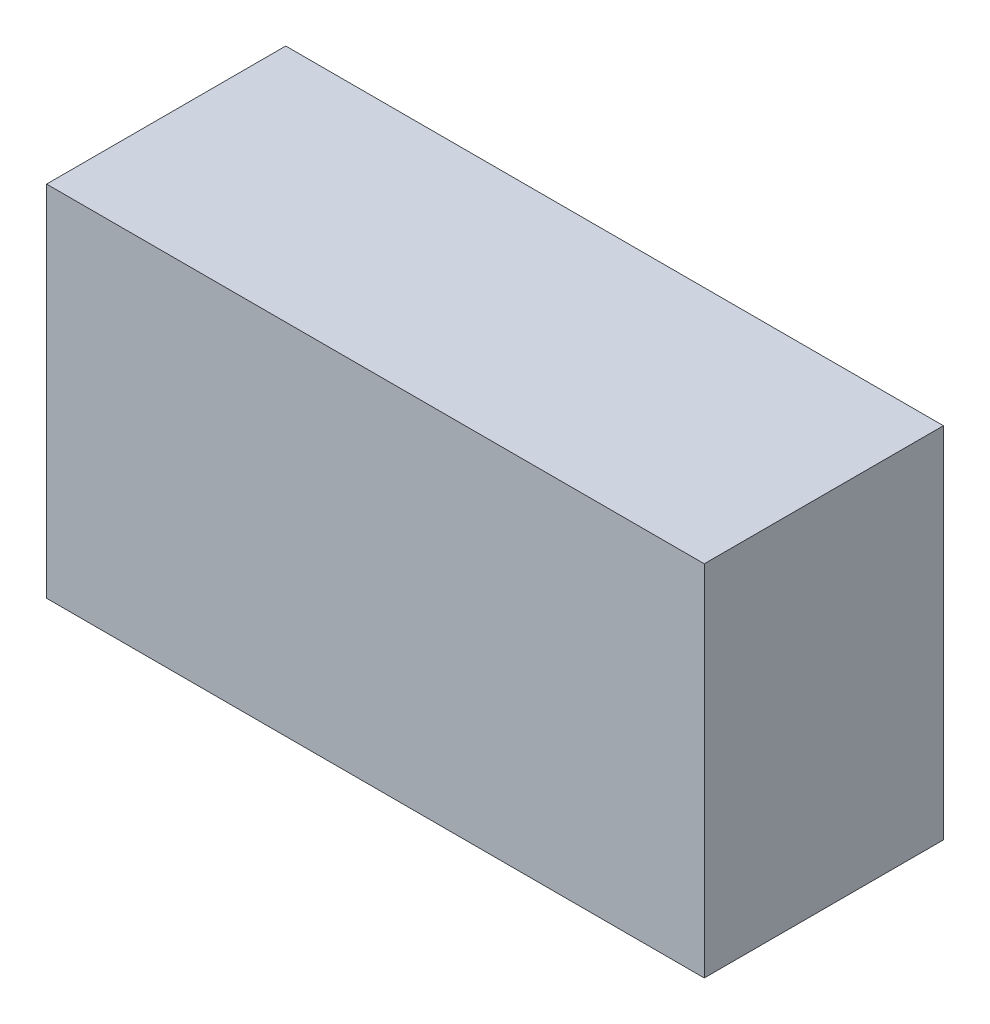
ISO-10303-21;
HEADER;
FILE_DESCRIPTION(('STEP AP214'),'2;1');
FILE_NAME('part.step','',(''),(''),'','','');
FILE_SCHEMA(('AUTOMOTIVE_DESIGN { 1 0 10303 214 1 1 1 1 }'));
ENDSEC;
DATA;
#1=APPLICATION_CONTEXT('core data for automotive mechanical design processes');
#2=APPLICATION_PROTOCOL_DEFINITION('international standard','automotive_design',2000,#1);
#3=PRODUCT_CONTEXT('',#1,'mechanical');
#4=PRODUCT('Part','Part','',(#3));
#5=PRODUCT_RELATED_PRODUCT_CATEGORY('part','',(#4));
#6=PRODUCT_DEFINITION_FORMATION('','',#4);
#7=PRODUCT_DEFINITION_CONTEXT('part definition',#1,'design');
#8=PRODUCT_DEFINITION('design','',#6,#7);
#9=PRODUCT_DEFINITION_SHAPE('','',#8);
#10=(LENGTH_UNIT() NAMED_UNIT(*) SI_UNIT(.MILLI.,.METRE.));
#11=(NAMED_UNIT(*) PLANE_ANGLE_UNIT() SI_UNIT($,.RADIAN.));
#12=(NAMED_UNIT(*) SI_UNIT($,.STERADIAN.) SOLID_ANGLE_UNIT());
#13=UNCERTAINTY_MEASURE_WITH_UNIT(LENGTH_MEASURE(1.E-05),#10,'distance_accuracy_value','');
#14=(GEOMETRIC_REPRESENTATION_CONTEXT(3) GLOBAL_UNCERTAINTY_ASSIGNED_CONTEXT((#13)) GLOBAL_UNIT_ASSIGNED_CONTEXT((#10,
#11,#12)) REPRESENTATION_CONTEXT('',''));
#15=CARTESIAN_POINT('',(0.,0.,0.));
#16=DIRECTION('',(0.,0.,1.));
#17=DIRECTION('',(1.,0.,0.));
#18=AXIS2_PLACEMENT_3D('',#15,#16,#17);
#19=CARTESIAN_POINT('',(-0.5499989,-0.2999994,0.));
#20=DIRECTION('',(0.,1.,0.));
#21=DIRECTION('',(1.,0.,0.));
#22=AXIS2_PLACEMENT_3D('',#19,#20,#21);
#23=PLANE('',#22);
#24=DIRECTION('',(1.,0.,0.));
#25=VECTOR('',#24,1.);
#26=CARTESIAN_POINT('',(-0.5499989,-0.2999994,0.));
#27=LINE('',#26,#25);
#28=CARTESIAN_POINT('',(-0.5499989,-0.2999994,0.));
#29=VERTEX_POINT('',#28);
#30=CARTESIAN_POINT('',(0.5499989,-0.2999994,0.));
#31=VERTEX_POINT('',#30);
#32=EDGE_CURVE('E9',#29,#31,#27,.T.);
#33=ORIENTED_EDGE('',*,*,#32,.T.);
#34=DIRECTION('',(0.,0.,1.));
#35=VECTOR('',#34,1.);
#36=CARTESIAN_POINT('',(0.5499989,-0.2999994,0.));
#37=LINE('',#36,#35);
#38=CARTESIAN_POINT('',(0.5499989,-0.2999994,0.3999992));
#39=VERTEX_POINT('',#38);
#40=EDGE_CURVE('E22',#31,#39,#37,.T.);
#41=ORIENTED_EDGE('',*,*,#40,.T.);
#42=DIRECTION('',(1.,0.,0.));
#43=VECTOR('',#42,1.);
#44=CARTESIAN_POINT('',(-0.5499989,-0.2999994,0.3999992));
#45=LINE('',#44,#43);
#46=CARTESIAN_POINT('',(-0.5499989,-0.2999994,0.3999992));
#47=VERTEX_POINT('',#46);
#48=EDGE_CURVE('E84',#47,#39,#45,.T.);
#49=ORIENTED_EDGE('',*,*,#48,.F.);
#50=DIRECTION('',(0.,0.,1.));
#51=VECTOR('',#50,1.);
#52=CARTESIAN_POINT('',(-0.5499989,-0.2999994,0.));
#53=LINE('',#52,#51);
#54=EDGE_CURVE('E32',#29,#47,#53,.T.);
#55=ORIENTED_EDGE('',*,*,#54,.F.);
#56=EDGE_LOOP('',(#33,#41,#49,#55));
#57=FACE_BOUND('',#56,.T.);
#58=ADVANCED_FACE('F15',(#57),#23,.F.);
#59=CARTESIAN_POINT('',(0.5499989,-0.2999994,0.));
#60=DIRECTION('',(-1.,0.,0.));
#61=DIRECTION('',(0.,1.,0.));
#62=AXIS2_PLACEMENT_3D('',#59,#60,#61);
#63=PLANE('',#62);
#64=DIRECTION('',(0.,1.,0.));
#65=VECTOR('',#64,1.);
#66=CARTESIAN_POINT('',(0.5499989,-0.2999994,0.));
#67=LINE('',#66,#65);
#68=CARTESIAN_POINT('',(0.5499989,0.2999994,0.));
#69=VERTEX_POINT('',#68);
#70=EDGE_CURVE('E81',#31,#69,#67,.T.);
#71=ORIENTED_EDGE('',*,*,#70,.T.);
#72=DIRECTION('',(0.,0.,1.));
#73=VECTOR('',#72,1.);
#74=CARTESIAN_POINT('',(0.5499989,0.2999994,0.));
#75=LINE('',#74,#73);
#76=CARTESIAN_POINT('',(0.5499989,0.2999994,0.3999992));
#77=VERTEX_POINT('',#76);
#78=EDGE_CURVE('E79',#69,#77,#75,.T.);
#79=ORIENTED_EDGE('',*,*,#78,.T.);
#80=DIRECTION('',(0.,1.,0.));
#81=VECTOR('',#80,1.);
#82=CARTESIAN_POINT('',(0.5499989,-0.2999994,0.3999992));
#83=LINE('',#82,#81);
#84=EDGE_CURVE('E65',#39,#77,#83,.T.);
#85=ORIENTED_EDGE('',*,*,#84,.F.);
#86=ORIENTED_EDGE('',*,*,#40,.F.);
#87=EDGE_LOOP('',(#71,#79,#85,#86));
#88=FACE_BOUND('',#87,.T.);
#89=ADVANCED_FACE('F87',(#88),#63,.F.);
#90=CARTESIAN_POINT('',(0.5499989,0.2999994,0.));
#91=DIRECTION('',(0.,-1.,0.));
#92=DIRECTION('',(-1.,0.,0.));
#93=AXIS2_PLACEMENT_3D('',#90,#91,#92);
#94=PLANE('',#93);
#95=DIRECTION('',(-1.,0.,0.));
#96=VECTOR('',#95,1.);
#97=CARTESIAN_POINT('',(0.5499989,0.2999994,0.));
#98=LINE('',#97,#96);
#99=CARTESIAN_POINT('',(-0.5499989,0.2999994,0.));
#100=VERTEX_POINT('',#99);
#101=EDGE_CURVE('E72',#69,#100,#98,.T.);
#102=ORIENTED_EDGE('',*,*,#101,.T.);
#103=DIRECTION('',(0.,0.,1.));
#104=VECTOR('',#103,1.);
#105=CARTESIAN_POINT('',(-0.5499989,0.2999994,0.));
#106=LINE('',#105,#104);
#107=CARTESIAN_POINT('',(-0.5499989,0.2999994,0.3999992));
#108=VERTEX_POINT('',#107);
#109=EDGE_CURVE('E56',#100,#108,#106,.T.);
#110=ORIENTED_EDGE('',*,*,#109,.T.);
#111=DIRECTION('',(-1.,0.,0.));
#112=VECTOR('',#111,1.);
#113=CARTESIAN_POINT('',(0.5499989,0.2999994,0.3999992));
#114=LINE('',#113,#112);
#115=EDGE_CURVE('E62',#77,#108,#114,.T.);
#116=ORIENTED_EDGE('',*,*,#115,.F.);
#117=ORIENTED_EDGE('',*,*,#78,.F.);
#118=EDGE_LOOP('',(#102,#110,#116,#117));
#119=FACE_BOUND('',#118,.T.);
#120=ADVANCED_FACE('F70',(#119),#94,.F.);
#121=CARTESIAN_POINT('',(-0.5499989,0.2999994,0.));
#122=DIRECTION('',(1.,0.,0.));
#123=DIRECTION('',(0.,-1.,0.));
#124=AXIS2_PLACEMENT_3D('',#121,#122,#123);
#125=PLANE('',#124);
#126=DIRECTION('',(0.,-1.,0.));
#127=VECTOR('',#126,1.);
#128=CARTESIAN_POINT('',(-0.5499989,0.2999994,0.));
#129=LINE('',#128,#127);
#130=EDGE_CURVE('E59',#100,#29,#129,.T.);
#131=ORIENTED_EDGE('',*,*,#130,.T.);
#132=ORIENTED_EDGE('',*,*,#54,.T.);
#133=DIRECTION('',(0.,-1.,0.));
#134=VECTOR('',#133,1.);
#135=CARTESIAN_POINT('',(-0.5499989,0.2999994,0.3999992));
#136=LINE('',#135,#134);
#137=EDGE_CURVE('E51',#108,#47,#136,.T.);
#138=ORIENTED_EDGE('',*,*,#137,.F.);
#139=ORIENTED_EDGE('',*,*,#109,.F.);
#140=EDGE_LOOP('',(#131,#132,#138,#139));
#141=FACE_BOUND('',#140,.T.);
#142=ADVANCED_FACE('F54',(#141),#125,.F.);
#143=CARTESIAN_POINT('',(-0.5499989,-0.2999994,0.));
#144=DIRECTION('',(0.,0.,-1.));
#145=DIRECTION('',(-1.,0.,0.));
#146=AXIS2_PLACEMENT_3D('',#143,#144,#145);
#147=PLANE('',#146);
#148=ORIENTED_EDGE('',*,*,#130,.F.);
#149=ORIENTED_EDGE('',*,*,#101,.F.);
#150=ORIENTED_EDGE('',*,*,#70,.F.);
#151=ORIENTED_EDGE('',*,*,#32,.F.);
#152=EDGE_LOOP('',(#148,#149,#150,#151));
#153=FACE_BOUND('',#152,.T.);
#154=ADVANCED_FACE('F89',(#153),#147,.T.);
#155=CARTESIAN_POINT('',(-0.5499989,-0.2999994,0.3999992));
#156=DIRECTION('',(0.,0.,-1.));
#157=DIRECTION('',(-1.,0.,0.));
#158=AXIS2_PLACEMENT_3D('',#155,#156,#157);
#159=PLANE('',#158);
#160=ORIENTED_EDGE('',*,*,#48,.T.);
#161=ORIENTED_EDGE('',*,*,#84,.T.);
#162=ORIENTED_EDGE('',*,*,#115,.T.);
#163=ORIENTED_EDGE('',*,*,#137,.T.);
#164=EDGE_LOOP('',(#160,#161,#162,#163));
#165=FACE_BOUND('',#164,.T.);
#166=ADVANCED_FACE('F63',(#165),#159,.F.);
#167=CLOSED_SHELL('',(#58,#89,#120,#142,#154,#166));
#168=MANIFOLD_SOLID_BREP('B1',#167);
#169=ADVANCED_BREP_SHAPE_REPRESENTATION('',(#18,#168),#14);
#170=SHAPE_DEFINITION_REPRESENTATION(#9,#169);
ENDSEC;
END-ISO-10303-21;
